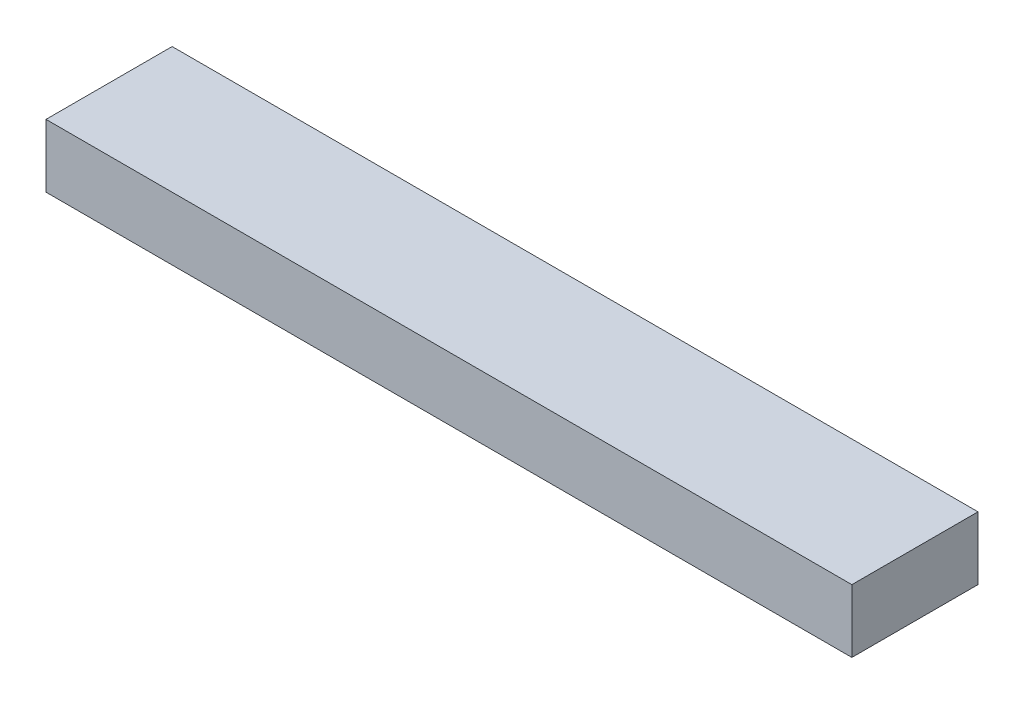
ISO-10303-21;
HEADER;
FILE_DESCRIPTION(('STEP AP214'),'2;1');
FILE_NAME('part.step','',(''),(''),'','','');
FILE_SCHEMA(('AUTOMOTIVE_DESIGN { 1 0 10303 214 1 1 1 1 }'));
ENDSEC;
DATA;
#1=APPLICATION_CONTEXT('core data for automotive mechanical design processes');
#2=APPLICATION_PROTOCOL_DEFINITION('international standard','automotive_design',2000,#1);
#3=PRODUCT_CONTEXT('',#1,'mechanical');
#4=PRODUCT('Part','Part','',(#3));
#5=PRODUCT_RELATED_PRODUCT_CATEGORY('part','',(#4));
#6=PRODUCT_DEFINITION_FORMATION('','',#4);
#7=PRODUCT_DEFINITION_CONTEXT('part definition',#1,'design');
#8=PRODUCT_DEFINITION('design','',#6,#7);
#9=PRODUCT_DEFINITION_SHAPE('','',#8);
#10=(LENGTH_UNIT() NAMED_UNIT(*) SI_UNIT(.MILLI.,.METRE.));
#11=(NAMED_UNIT(*) PLANE_ANGLE_UNIT() SI_UNIT($,.RADIAN.));
#12=(NAMED_UNIT(*) SI_UNIT($,.STERADIAN.) SOLID_ANGLE_UNIT());
#13=UNCERTAINTY_MEASURE_WITH_UNIT(LENGTH_MEASURE(1.E-05),#10,'distance_accuracy_value','');
#14=(GEOMETRIC_REPRESENTATION_CONTEXT(3) GLOBAL_UNCERTAINTY_ASSIGNED_CONTEXT((#13)) GLOBAL_UNIT_ASSIGNED_CONTEXT((#10,
#11,#12)) REPRESENTATION_CONTEXT('',''));
#15=CARTESIAN_POINT('',(0.,0.,0.));
#16=DIRECTION('',(0.,0.,1.));
#17=DIRECTION('',(1.,0.,0.));
#18=AXIS2_PLACEMENT_3D('',#15,#16,#17);
#19=CARTESIAN_POINT('',(120.,470.,-436.));
#20=DIRECTION('',(-1.,0.,0.));
#21=DIRECTION('',(0.,0.,1.));
#22=AXIS2_PLACEMENT_3D('',#19,#20,#21);
#23=PLANE('',#22);
#24=DIRECTION('',(0.,-1.,0.));
#25=VECTOR('',#24,1.);
#26=CARTESIAN_POINT('',(120.,470.,-364.));
#27=LINE('',#26,#25);
#28=CARTESIAN_POINT('',(120.,506.,-364.));
#29=VERTEX_POINT('',#28);
#30=CARTESIAN_POINT('',(120.,470.,-364.));
#31=VERTEX_POINT('',#30);
#32=EDGE_CURVE('E103',#29,#31,#27,.T.);
#33=ORIENTED_EDGE('',*,*,#32,.F.);
#34=DIRECTION('',(0.,0.,1.));
#35=VECTOR('',#34,1.);
#36=CARTESIAN_POINT('',(120.,506.,-436.));
#37=LINE('',#36,#35);
#38=CARTESIAN_POINT('',(120.,506.,-436.));
#39=VERTEX_POINT('',#38);
#40=EDGE_CURVE('E11',#39,#29,#37,.T.);
#41=ORIENTED_EDGE('',*,*,#40,.F.);
#42=DIRECTION('',(0.,-1.,0.));
#43=VECTOR('',#42,1.);
#44=CARTESIAN_POINT('',(120.,470.,-436.));
#45=LINE('',#44,#43);
#46=CARTESIAN_POINT('',(120.,470.,-436.));
#47=VERTEX_POINT('',#46);
#48=EDGE_CURVE('E97',#39,#47,#45,.T.);
#49=ORIENTED_EDGE('',*,*,#48,.T.);
#50=DIRECTION('',(0.,0.,1.));
#51=VECTOR('',#50,1.);
#52=CARTESIAN_POINT('',(120.,470.,-436.));
#53=LINE('',#52,#51);
#54=EDGE_CURVE('E42',#47,#31,#53,.T.);
#55=ORIENTED_EDGE('',*,*,#54,.T.);
#56=EDGE_LOOP('',(#33,#41,#49,#55));
#57=FACE_BOUND('',#56,.T.);
#58=ADVANCED_FACE('F39',(#57),#23,.T.);
#59=CARTESIAN_POINT('',(120.,506.,-436.));
#60=DIRECTION('',(0.,1.,0.));
#61=DIRECTION('',(0.,0.,1.));
#62=AXIS2_PLACEMENT_3D('',#59,#60,#61);
#63=PLANE('',#62);
#64=DIRECTION('',(-1.,0.,0.));
#65=VECTOR('',#64,1.);
#66=CARTESIAN_POINT('',(120.,506.,-364.));
#67=LINE('',#66,#65);
#68=CARTESIAN_POINT('',(580.,506.,-364.));
#69=VERTEX_POINT('',#68);
#70=EDGE_CURVE('E99',#69,#29,#67,.T.);
#71=ORIENTED_EDGE('',*,*,#70,.F.);
#72=DIRECTION('',(0.,0.,1.));
#73=VECTOR('',#72,1.);
#74=CARTESIAN_POINT('',(580.,506.,-436.));
#75=LINE('',#74,#73);
#76=CARTESIAN_POINT('',(580.,506.,-436.));
#77=VERTEX_POINT('',#76);
#78=EDGE_CURVE('E48',#77,#69,#75,.T.);
#79=ORIENTED_EDGE('',*,*,#78,.F.);
#80=DIRECTION('',(-1.,0.,0.));
#81=VECTOR('',#80,1.);
#82=CARTESIAN_POINT('',(120.,506.,-436.));
#83=LINE('',#82,#81);
#84=EDGE_CURVE('E94',#77,#39,#83,.T.);
#85=ORIENTED_EDGE('',*,*,#84,.T.);
#86=ORIENTED_EDGE('',*,*,#40,.T.);
#87=EDGE_LOOP('',(#71,#79,#85,#86));
#88=FACE_BOUND('',#87,.T.);
#89=ADVANCED_FACE('F113',(#88),#63,.T.);
#90=CARTESIAN_POINT('',(580.,470.,-436.));
#91=DIRECTION('',(1.,0.,0.));
#92=DIRECTION('',(0.,0.,-1.));
#93=AXIS2_PLACEMENT_3D('',#90,#91,#92);
#94=PLANE('',#93);
#95=DIRECTION('',(0.,1.,0.));
#96=VECTOR('',#95,1.);
#97=CARTESIAN_POINT('',(580.,470.,-364.));
#98=LINE('',#97,#96);
#99=CARTESIAN_POINT('',(580.,470.,-364.));
#100=VERTEX_POINT('',#99);
#101=EDGE_CURVE('E89',#100,#69,#98,.T.);
#102=ORIENTED_EDGE('',*,*,#101,.F.);
#103=DIRECTION('',(0.,0.,1.));
#104=VECTOR('',#103,1.);
#105=CARTESIAN_POINT('',(580.,470.,-436.));
#106=LINE('',#105,#104);
#107=CARTESIAN_POINT('',(580.,470.,-436.));
#108=VERTEX_POINT('',#107);
#109=EDGE_CURVE('E84',#108,#100,#106,.T.);
#110=ORIENTED_EDGE('',*,*,#109,.F.);
#111=DIRECTION('',(0.,1.,0.));
#112=VECTOR('',#111,1.);
#113=CARTESIAN_POINT('',(580.,470.,-436.));
#114=LINE('',#113,#112);
#115=EDGE_CURVE('E87',#108,#77,#114,.T.);
#116=ORIENTED_EDGE('',*,*,#115,.T.);
#117=ORIENTED_EDGE('',*,*,#78,.T.);
#118=EDGE_LOOP('',(#102,#110,#116,#117));
#119=FACE_BOUND('',#118,.T.);
#120=ADVANCED_FACE('F86',(#119),#94,.T.);
#121=CARTESIAN_POINT('',(120.,470.,-436.));
#122=DIRECTION('',(0.,-1.,0.));
#123=DIRECTION('',(0.,0.,-1.));
#124=AXIS2_PLACEMENT_3D('',#121,#122,#123);
#125=PLANE('',#124);
#126=DIRECTION('',(1.,0.,0.));
#127=VECTOR('',#126,1.);
#128=CARTESIAN_POINT('',(120.,470.,-364.));
#129=LINE('',#128,#127);
#130=EDGE_CURVE('E106',#31,#100,#129,.T.);
#131=ORIENTED_EDGE('',*,*,#130,.F.);
#132=ORIENTED_EDGE('',*,*,#54,.F.);
#133=DIRECTION('',(1.,0.,0.));
#134=VECTOR('',#133,1.);
#135=CARTESIAN_POINT('',(120.,470.,-436.));
#136=LINE('',#135,#134);
#137=EDGE_CURVE('E93',#47,#108,#136,.T.);
#138=ORIENTED_EDGE('',*,*,#137,.T.);
#139=ORIENTED_EDGE('',*,*,#109,.T.);
#140=EDGE_LOOP('',(#131,#132,#138,#139));
#141=FACE_BOUND('',#140,.T.);
#142=ADVANCED_FACE('F96',(#141),#125,.T.);
#143=CARTESIAN_POINT('',(0.,0.,-436.));
#144=DIRECTION('',(0.,0.,-1.));
#145=DIRECTION('',(-1.,0.,0.));
#146=AXIS2_PLACEMENT_3D('',#143,#144,#145);
#147=PLANE('',#146);
#148=ORIENTED_EDGE('',*,*,#48,.F.);
#149=ORIENTED_EDGE('',*,*,#84,.F.);
#150=ORIENTED_EDGE('',*,*,#115,.F.);
#151=ORIENTED_EDGE('',*,*,#137,.F.);
#152=EDGE_LOOP('',(#148,#149,#150,#151));
#153=FACE_BOUND('',#152,.T.);
#154=ADVANCED_FACE('F92',(#153),#147,.T.);
#155=CARTESIAN_POINT('',(0.,0.,-364.));
#156=DIRECTION('',(0.,0.,-1.));
#157=DIRECTION('',(-1.,0.,0.));
#158=AXIS2_PLACEMENT_3D('',#155,#156,#157);
#159=PLANE('',#158);
#160=ORIENTED_EDGE('',*,*,#32,.T.);
#161=ORIENTED_EDGE('',*,*,#130,.T.);
#162=ORIENTED_EDGE('',*,*,#101,.T.);
#163=ORIENTED_EDGE('',*,*,#70,.T.);
#164=EDGE_LOOP('',(#160,#161,#162,#163));
#165=FACE_BOUND('',#164,.T.);
#166=ADVANCED_FACE('F112',(#165),#159,.F.);
#167=CLOSED_SHELL('',(#58,#89,#120,#142,#154,#166));
#168=MANIFOLD_SOLID_BREP('B2',#167);
#169=ADVANCED_BREP_SHAPE_REPRESENTATION('',(#18,#168),#14);
#170=SHAPE_DEFINITION_REPRESENTATION(#9,#169);
ENDSEC;
END-ISO-10303-21;
